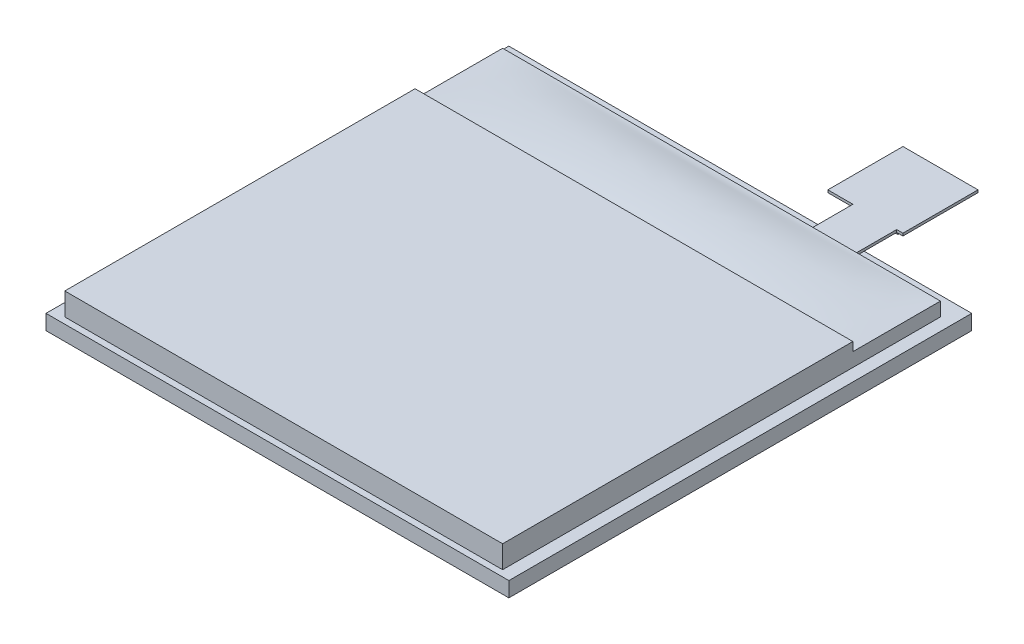
ISO-10303-21;
HEADER;
FILE_DESCRIPTION(('STEP AP214'),'2;1');
FILE_NAME('part.step','',(''),(''),'','','');
FILE_SCHEMA(('AUTOMOTIVE_DESIGN { 1 0 10303 214 1 1 1 1 }'));
ENDSEC;
DATA;
#1=APPLICATION_CONTEXT('core data for automotive mechanical design processes');
#2=APPLICATION_PROTOCOL_DEFINITION('international standard','automotive_design',2000,#1);
#3=PRODUCT_CONTEXT('',#1,'mechanical');
#4=PRODUCT('Part','Part','',(#3));
#5=PRODUCT_RELATED_PRODUCT_CATEGORY('part','',(#4));
#6=PRODUCT_DEFINITION_FORMATION('','',#4);
#7=PRODUCT_DEFINITION_CONTEXT('part definition',#1,'design');
#8=PRODUCT_DEFINITION('design','',#6,#7);
#9=PRODUCT_DEFINITION_SHAPE('','',#8);
#10=(LENGTH_UNIT() NAMED_UNIT(*) SI_UNIT(.MILLI.,.METRE.));
#11=(NAMED_UNIT(*) PLANE_ANGLE_UNIT() SI_UNIT($,.RADIAN.));
#12=(NAMED_UNIT(*) SI_UNIT($,.STERADIAN.) SOLID_ANGLE_UNIT());
#13=UNCERTAINTY_MEASURE_WITH_UNIT(LENGTH_MEASURE(1.E-05),#10,'distance_accuracy_value','');
#14=(GEOMETRIC_REPRESENTATION_CONTEXT(3) GLOBAL_UNCERTAINTY_ASSIGNED_CONTEXT((#13)) GLOBAL_UNIT_ASSIGNED_CONTEXT((#10,
#11,#12)) REPRESENTATION_CONTEXT('',''));
#15=CARTESIAN_POINT('',(0.,0.,0.));
#16=DIRECTION('',(0.,0.,1.));
#17=DIRECTION('',(1.,0.,0.));
#18=AXIS2_PLACEMENT_3D('',#15,#16,#17);
#19=CARTESIAN_POINT('',(0.,1.8,0.));
#20=DIRECTION('',(0.,-1.,0.));
#21=DIRECTION('',(0.,0.,-1.));
#22=AXIS2_PLACEMENT_3D('',#19,#20,#21);
#23=PLANE('',#22);
#24=DIRECTION('',(1.,0.,0.));
#25=VECTOR('',#24,1.);
#26=CARTESIAN_POINT('',(5.00000000000001,1.8,-20.5));
#27=LINE('',#26,#25);
#28=CARTESIAN_POINT('',(5.00000000000001,1.8,-20.5));
#29=VERTEX_POINT('',#28);
#30=CARTESIAN_POINT('',(7.00000000000001,1.8,-20.5));
#31=VERTEX_POINT('',#30);
#32=EDGE_CURVE('E279',#29,#31,#27,.T.);
#33=ORIENTED_EDGE('',*,*,#32,.F.);
#34=DIRECTION('',(0.,0.,1.));
#35=VECTOR('',#34,1.);
#36=CARTESIAN_POINT('',(5.00000000000001,1.8,-26.5));
#37=LINE('',#36,#35);
#38=CARTESIAN_POINT('',(5.00000000000001,1.8,-26.5));
#39=VERTEX_POINT('',#38);
#40=EDGE_CURVE('E300',#39,#29,#37,.T.);
#41=ORIENTED_EDGE('',*,*,#40,.F.);
#42=DIRECTION('',(-1.,0.,0.));
#43=VECTOR('',#42,1.);
#44=CARTESIAN_POINT('',(11.,1.8,-26.5));
#45=LINE('',#44,#43);
#46=CARTESIAN_POINT('',(11.,1.8,-26.5));
#47=VERTEX_POINT('',#46);
#48=EDGE_CURVE('E297',#47,#39,#45,.T.);
#49=ORIENTED_EDGE('',*,*,#48,.F.);
#50=DIRECTION('',(0.,0.,-1.));
#51=VECTOR('',#50,1.);
#52=CARTESIAN_POINT('',(11.,1.8,-20.5));
#53=LINE('',#52,#51);
#54=CARTESIAN_POINT('',(11.,1.8,-20.5));
#55=VERTEX_POINT('',#54);
#56=EDGE_CURVE('E294',#55,#47,#53,.T.);
#57=ORIENTED_EDGE('',*,*,#56,.F.);
#58=DIRECTION('',(1.,0.,0.));
#59=VECTOR('',#58,1.);
#60=CARTESIAN_POINT('',(10.5,1.8,-20.5));
#61=LINE('',#60,#59);
#62=CARTESIAN_POINT('',(10.5,1.8,-20.5));
#63=VERTEX_POINT('',#62);
#64=EDGE_CURVE('E291',#63,#55,#61,.T.);
#65=ORIENTED_EDGE('',*,*,#64,.F.);
#66=DIRECTION('',(0.,0.,-1.));
#67=VECTOR('',#66,1.);
#68=CARTESIAN_POINT('',(10.5,1.8,-17.));
#69=LINE('',#68,#67);
#70=CARTESIAN_POINT('',(10.5,1.8,-17.));
#71=VERTEX_POINT('',#70);
#72=EDGE_CURVE('E288',#71,#63,#69,.T.);
#73=ORIENTED_EDGE('',*,*,#72,.F.);
#74=DIRECTION('',(1.,0.,0.));
#75=VECTOR('',#74,1.);
#76=CARTESIAN_POINT('',(7.00000000000001,1.8,-17.));
#77=LINE('',#76,#75);
#78=CARTESIAN_POINT('',(7.00000000000001,1.8,-17.));
#79=VERTEX_POINT('',#78);
#80=EDGE_CURVE('E286',#79,#71,#77,.T.);
#81=ORIENTED_EDGE('',*,*,#80,.F.);
#82=DIRECTION('',(0.,0.,1.));
#83=VECTOR('',#82,1.);
#84=CARTESIAN_POINT('',(7.00000000000001,1.8,-20.5));
#85=LINE('',#84,#83);
#86=EDGE_CURVE('E282',#31,#79,#85,.T.);
#87=ORIENTED_EDGE('',*,*,#86,.F.);
#88=EDGE_LOOP('',(#33,#41,#49,#57,#65,#73,#81,#87));
#89=FACE_BOUND('',#88,.T.);
#90=DIRECTION('',(-1.,0.,0.));
#91=VECTOR('',#90,1.);
#92=CARTESIAN_POINT('',(6.40000000000001,1.8,-21.5));
#93=LINE('',#92,#91);
#94=CARTESIAN_POINT('',(9.60000000000001,1.8,-21.5));
#95=VERTEX_POINT('',#94);
#96=CARTESIAN_POINT('',(6.40000000000001,1.8,-21.5));
#97=VERTEX_POINT('',#96);
#98=EDGE_CURVE('E265',#95,#97,#93,.T.);
#99=ORIENTED_EDGE('',*,*,#98,.F.);
#100=DIRECTION('',(0.,0.,1.));
#101=VECTOR('',#100,1.);
#102=CARTESIAN_POINT('',(9.60000000000001,1.8,-21.5));
#103=LINE('',#102,#101);
#104=CARTESIAN_POINT('',(9.60000000000001,1.8,-25.5));
#105=VERTEX_POINT('',#104);
#106=EDGE_CURVE('E248',#105,#95,#103,.T.);
#107=ORIENTED_EDGE('',*,*,#106,.F.);
#108=DIRECTION('',(1.,0.,0.));
#109=VECTOR('',#108,1.);
#110=CARTESIAN_POINT('',(6.40000000000001,1.8,-25.5));
#111=LINE('',#110,#109);
#112=CARTESIAN_POINT('',(6.40000000000001,1.8,-25.5));
#113=VERTEX_POINT('',#112);
#114=EDGE_CURVE('E256',#113,#105,#111,.T.);
#115=ORIENTED_EDGE('',*,*,#114,.F.);
#116=DIRECTION('',(0.,0.,-1.));
#117=VECTOR('',#116,1.);
#118=CARTESIAN_POINT('',(6.40000000000001,1.8,-21.5));
#119=LINE('',#118,#117);
#120=EDGE_CURVE('E267',#97,#113,#119,.T.);
#121=ORIENTED_EDGE('',*,*,#120,.F.);
#122=EDGE_LOOP('',(#99,#107,#115,#121));
#123=FACE_BOUND('',#122,.T.);
#124=ADVANCED_FACE('F37',(#89,#123),#23,.T.);
#125=CARTESIAN_POINT('',(-17.5,2.3,-10.));
#126=CARTESIAN_POINT('',(-5.83333333333334,2.3,-10.));
#127=CARTESIAN_POINT('',(5.83333333333333,2.3,-10.));
#128=CARTESIAN_POINT('',(17.5,2.3,-10.));
#129=CARTESIAN_POINT('',(-17.5,2.3,-12.3333333333333));
#130=CARTESIAN_POINT('',(-5.83333333333334,3.18888888888889,-12.3333333333333));
#131=CARTESIAN_POINT('',(5.83333333333333,3.18888888888889,-12.3333333333333));
#132=CARTESIAN_POINT('',(17.5,2.3,-12.3333333333333));
#133=CARTESIAN_POINT('',(-17.5,2.3,-14.6666666666667));
#134=CARTESIAN_POINT('',(-5.83333333333334,3.18888888888889,-14.6666666666667));
#135=CARTESIAN_POINT('',(5.83333333333333,3.18888888888889,-14.6666666666667));
#136=CARTESIAN_POINT('',(17.5,2.3,-14.6666666666667));
#137=CARTESIAN_POINT('',(-17.5,2.3,-17.));
#138=CARTESIAN_POINT('',(-5.83333333333334,2.3,-17.));
#139=CARTESIAN_POINT('',(5.83333333333333,2.3,-17.));
#140=CARTESIAN_POINT('',(17.5,2.3,-17.));
#141=B_SPLINE_SURFACE_WITH_KNOTS('',3,3,((#125,#126,#127,#128),(#129,#130,#131,#132),(#133,#134,
#135,#136),(#137,#138,#139,#140)),.UNSPECIFIED.,.F.,.F.,.F.,(4,4),(4,4),(0.,1.),(0.,1.),.UNSPECIFIED.);
#142=DIRECTION('',(0.,0.,1.));
#143=VECTOR('',#142,1.);
#144=CARTESIAN_POINT('',(-17.5,2.3,-17.));
#145=LINE('',#144,#143);
#146=CARTESIAN_POINT('',(-17.5,2.3,-17.));
#147=VERTEX_POINT('',#146);
#148=CARTESIAN_POINT('',(-17.5,2.3,-10.));
#149=VERTEX_POINT('',#148);
#150=EDGE_CURVE('E362',#147,#149,#145,.T.);
#151=DIRECTION('',(1.,0.,0.));
#152=VECTOR('',#151,1.);
#153=CARTESIAN_POINT('',(0.,2.3,-10.));
#154=LINE('',#153,#152);
#155=CARTESIAN_POINT('',(17.5,2.3,-10.));
#156=VERTEX_POINT('',#155);
#157=EDGE_CURVE('E11',#149,#156,#154,.T.);
#158=DIRECTION('',(0.,0.,-1.));
#159=VECTOR('',#158,1.);
#160=CARTESIAN_POINT('',(17.5,2.3,-17.));
#161=LINE('',#160,#159);
#162=CARTESIAN_POINT('',(17.5,2.3,-17.));
#163=VERTEX_POINT('',#162);
#164=EDGE_CURVE('E357',#156,#163,#161,.T.);
#165=DIRECTION('',(-1.,0.,0.));
#166=VECTOR('',#165,1.);
#167=CARTESIAN_POINT('',(-17.5,2.3,-17.));
#168=LINE('',#167,#166);
#169=EDGE_CURVE('E411',#163,#147,#168,.T.);
#170=ORIENTED_EDGE('',*,*,#150,.T.);
#171=ORIENTED_EDGE('',*,*,#157,.T.);
#172=ORIENTED_EDGE('',*,*,#164,.T.);
#173=ORIENTED_EDGE('',*,*,#169,.T.);
#174=EDGE_LOOP('',(#170,#171,#172,#173));
#175=FACE_BOUND('',#174,.T.);
#176=ADVANCED_FACE('F39',(#175),#141,.F.);
#177=CARTESIAN_POINT('',(0.,1.2,0.));
#178=DIRECTION('',(0.,1.,0.));
#179=DIRECTION('',(0.,0.,1.));
#180=AXIS2_PLACEMENT_3D('',#177,#178,#179);
#181=PLANE('',#180);
#182=DIRECTION('',(0.,0.,-1.));
#183=VECTOR('',#182,1.);
#184=CARTESIAN_POINT('',(18.5,1.2,-18.5));
#185=LINE('',#184,#183);
#186=CARTESIAN_POINT('',(18.5,1.2,18.5));
#187=VERTEX_POINT('',#186);
#188=CARTESIAN_POINT('',(18.5,1.2,-18.5));
#189=VERTEX_POINT('',#188);
#190=EDGE_CURVE('E381',#187,#189,#185,.T.);
#191=ORIENTED_EDGE('',*,*,#190,.T.);
#192=DIRECTION('',(-1.,0.,0.));
#193=VECTOR('',#192,1.);
#194=CARTESIAN_POINT('',(-18.5,1.2,-18.5));
#195=LINE('',#194,#193);
#196=CARTESIAN_POINT('',(-18.5,1.2,-18.5));
#197=VERTEX_POINT('',#196);
#198=EDGE_CURVE('E384',#189,#197,#195,.T.);
#199=ORIENTED_EDGE('',*,*,#198,.T.);
#200=DIRECTION('',(0.,0.,1.));
#201=VECTOR('',#200,1.);
#202=CARTESIAN_POINT('',(-18.5,1.2,-18.5));
#203=LINE('',#202,#201);
#204=CARTESIAN_POINT('',(-18.5,1.2,18.5));
#205=VERTEX_POINT('',#204);
#206=EDGE_CURVE('E387',#197,#205,#203,.T.);
#207=ORIENTED_EDGE('',*,*,#206,.T.);
#208=DIRECTION('',(1.,0.,0.));
#209=VECTOR('',#208,1.);
#210=CARTESIAN_POINT('',(-18.5,1.2,18.5));
#211=LINE('',#210,#209);
#212=EDGE_CURVE('E389',#205,#187,#211,.T.);
#213=ORIENTED_EDGE('',*,*,#212,.T.);
#214=EDGE_LOOP('',(#191,#199,#207,#213));
#215=FACE_BOUND('',#214,.T.);
#216=DIRECTION('',(1.,0.,0.));
#217=VECTOR('',#216,1.);
#218=CARTESIAN_POINT('',(0.,1.2,-17.));
#219=LINE('',#218,#217);
#220=CARTESIAN_POINT('',(-17.5,1.2,-17.));
#221=VERTEX_POINT('',#220);
#222=CARTESIAN_POINT('',(17.5,1.2,-17.));
#223=VERTEX_POINT('',#222);
#224=EDGE_CURVE('E375',#221,#223,#219,.T.);
#225=ORIENTED_EDGE('',*,*,#224,.T.);
#226=DIRECTION('',(0.,0.,1.));
#227=VECTOR('',#226,1.);
#228=CARTESIAN_POINT('',(17.5,1.2,0.));
#229=LINE('',#228,#227);
#230=CARTESIAN_POINT('',(17.5,1.2,18.));
#231=VERTEX_POINT('',#230);
#232=EDGE_CURVE('E378',#223,#231,#229,.T.);
#233=ORIENTED_EDGE('',*,*,#232,.T.);
#234=DIRECTION('',(-1.,0.,0.));
#235=VECTOR('',#234,1.);
#236=CARTESIAN_POINT('',(0.,1.2,18.));
#237=LINE('',#236,#235);
#238=CARTESIAN_POINT('',(-17.5,1.2,18.));
#239=VERTEX_POINT('',#238);
#240=EDGE_CURVE('E370',#231,#239,#237,.T.);
#241=ORIENTED_EDGE('',*,*,#240,.T.);
#242=DIRECTION('',(0.,0.,-1.));
#243=VECTOR('',#242,1.);
#244=CARTESIAN_POINT('',(-17.5,1.2,0.));
#245=LINE('',#244,#243);
#246=EDGE_CURVE('E373',#239,#221,#245,.T.);
#247=ORIENTED_EDGE('',*,*,#246,.T.);
#248=EDGE_LOOP('',(#225,#233,#241,#247));
#249=FACE_BOUND('',#248,.T.);
#250=ADVANCED_FACE('F427',(#215,#249),#181,.T.);
#251=CARTESIAN_POINT('',(18.5,1.2,-18.5));
#252=DIRECTION('',(-1.,0.,0.));
#253=DIRECTION('',(0.,0.,1.));
#254=AXIS2_PLACEMENT_3D('',#251,#252,#253);
#255=PLANE('',#254);
#256=DIRECTION('',(0.,0.,-1.));
#257=VECTOR('',#256,1.);
#258=CARTESIAN_POINT('',(18.5,0.,-18.5));
#259=LINE('',#258,#257);
#260=CARTESIAN_POINT('',(18.5,0.,18.5));
#261=VERTEX_POINT('',#260);
#262=CARTESIAN_POINT('',(18.5,0.,-18.5));
#263=VERTEX_POINT('',#262);
#264=EDGE_CURVE('E380',#261,#263,#259,.T.);
#265=ORIENTED_EDGE('',*,*,#264,.T.);
#266=DIRECTION('',(0.,-1.,0.));
#267=VECTOR('',#266,1.);
#268=CARTESIAN_POINT('',(18.5,1.2,-18.5));
#269=LINE('',#268,#267);
#270=EDGE_CURVE('E47',#189,#263,#269,.T.);
#271=ORIENTED_EDGE('',*,*,#270,.F.);
#272=ORIENTED_EDGE('',*,*,#190,.F.);
#273=DIRECTION('',(0.,-1.,0.));
#274=VECTOR('',#273,1.);
#275=CARTESIAN_POINT('',(18.5,1.2,18.5));
#276=LINE('',#275,#274);
#277=EDGE_CURVE('E391',#187,#261,#276,.T.);
#278=ORIENTED_EDGE('',*,*,#277,.T.);
#279=EDGE_LOOP('',(#265,#271,#272,#278));
#280=FACE_BOUND('',#279,.T.);
#281=ADVANCED_FACE('F521',(#280),#255,.F.);
#282=CARTESIAN_POINT('',(-18.5,1.2,-18.5));
#283=DIRECTION('',(0.,0.,1.));
#284=DIRECTION('',(1.,0.,0.));
#285=AXIS2_PLACEMENT_3D('',#282,#283,#284);
#286=PLANE('',#285);
#287=DIRECTION('',(-1.,0.,0.));
#288=VECTOR('',#287,1.);
#289=CARTESIAN_POINT('',(-18.5,0.,-18.5));
#290=LINE('',#289,#288);
#291=CARTESIAN_POINT('',(-18.5,0.,-18.5));
#292=VERTEX_POINT('',#291);
#293=EDGE_CURVE('E394',#263,#292,#290,.T.);
#294=ORIENTED_EDGE('',*,*,#293,.T.);
#295=DIRECTION('',(0.,-1.,0.));
#296=VECTOR('',#295,1.);
#297=CARTESIAN_POINT('',(-18.5,1.2,-18.5));
#298=LINE('',#297,#296);
#299=EDGE_CURVE('E404',#197,#292,#298,.T.);
#300=ORIENTED_EDGE('',*,*,#299,.F.);
#301=ORIENTED_EDGE('',*,*,#198,.F.);
#302=ORIENTED_EDGE('',*,*,#270,.T.);
#303=EDGE_LOOP('',(#294,#300,#301,#302));
#304=FACE_BOUND('',#303,.T.);
#305=ADVANCED_FACE('F533',(#304),#286,.F.);
#306=CARTESIAN_POINT('',(-18.5,1.2,-18.5));
#307=DIRECTION('',(1.,0.,0.));
#308=DIRECTION('',(0.,0.,-1.));
#309=AXIS2_PLACEMENT_3D('',#306,#307,#308);
#310=PLANE('',#309);
#311=DIRECTION('',(0.,0.,1.));
#312=VECTOR('',#311,1.);
#313=CARTESIAN_POINT('',(-18.5,0.,-18.5));
#314=LINE('',#313,#312);
#315=CARTESIAN_POINT('',(-18.5,0.,18.5));
#316=VERTEX_POINT('',#315);
#317=EDGE_CURVE('E396',#292,#316,#314,.T.);
#318=ORIENTED_EDGE('',*,*,#317,.T.);
#319=DIRECTION('',(0.,-1.,0.));
#320=VECTOR('',#319,1.);
#321=CARTESIAN_POINT('',(-18.5,1.2,18.5));
#322=LINE('',#321,#320);
#323=EDGE_CURVE('E401',#205,#316,#322,.T.);
#324=ORIENTED_EDGE('',*,*,#323,.F.);
#325=ORIENTED_EDGE('',*,*,#206,.F.);
#326=ORIENTED_EDGE('',*,*,#299,.T.);
#327=EDGE_LOOP('',(#318,#324,#325,#326));
#328=FACE_BOUND('',#327,.T.);
#329=ADVANCED_FACE('F529',(#328),#310,.F.);
#330=CARTESIAN_POINT('',(-18.5,1.2,18.5));
#331=DIRECTION('',(0.,0.,-1.));
#332=DIRECTION('',(-1.,0.,0.));
#333=AXIS2_PLACEMENT_3D('',#330,#331,#332);
#334=PLANE('',#333);
#335=DIRECTION('',(1.,0.,0.));
#336=VECTOR('',#335,1.);
#337=CARTESIAN_POINT('',(-18.5,0.,18.5));
#338=LINE('',#337,#336);
#339=EDGE_CURVE('E385',#316,#261,#338,.T.);
#340=ORIENTED_EDGE('',*,*,#339,.T.);
#341=ORIENTED_EDGE('',*,*,#277,.F.);
#342=ORIENTED_EDGE('',*,*,#212,.F.);
#343=ORIENTED_EDGE('',*,*,#323,.T.);
#344=EDGE_LOOP('',(#340,#341,#342,#343));
#345=FACE_BOUND('',#344,.T.);
#346=ADVANCED_FACE('F525',(#345),#334,.F.);
#347=CARTESIAN_POINT('',(0.,0.,0.));
#348=DIRECTION('',(0.,1.,0.));
#349=DIRECTION('',(0.,0.,1.));
#350=AXIS2_PLACEMENT_3D('',#347,#348,#349);
#351=PLANE('',#350);
#352=ORIENTED_EDGE('',*,*,#264,.F.);
#353=ORIENTED_EDGE('',*,*,#339,.F.);
#354=ORIENTED_EDGE('',*,*,#317,.F.);
#355=ORIENTED_EDGE('',*,*,#293,.F.);
#356=EDGE_LOOP('',(#352,#353,#354,#355));
#357=FACE_BOUND('',#356,.T.);
#358=ADVANCED_FACE('F515',(#357),#351,.F.);
#359=CARTESIAN_POINT('',(17.5,2.3,-17.));
#360=DIRECTION('',(-1.,0.,0.));
#361=DIRECTION('',(0.,0.,1.));
#362=AXIS2_PLACEMENT_3D('',#359,#360,#361);
#363=PLANE('',#362);
#364=DIRECTION('',(0.,-1.,0.));
#365=VECTOR('',#364,1.);
#366=CARTESIAN_POINT('',(17.5,2.3,18.));
#367=LINE('',#366,#365);
#368=CARTESIAN_POINT('',(17.5,3.,18.));
#369=VERTEX_POINT('',#368);
#370=EDGE_CURVE('E358',#369,#231,#367,.T.);
#371=ORIENTED_EDGE('',*,*,#370,.T.);
#372=ORIENTED_EDGE('',*,*,#232,.F.);
#373=DIRECTION('',(0.,-1.,0.));
#374=VECTOR('',#373,1.);
#375=CARTESIAN_POINT('',(17.5,2.3,-17.));
#376=LINE('',#375,#374);
#377=EDGE_CURVE('E367',#163,#223,#376,.T.);
#378=ORIENTED_EDGE('',*,*,#377,.F.);
#379=ORIENTED_EDGE('',*,*,#164,.F.);
#380=DIRECTION('',(0.,-1.,0.));
#381=VECTOR('',#380,1.);
#382=CARTESIAN_POINT('',(17.5,3.,-10.));
#383=LINE('',#382,#381);
#384=CARTESIAN_POINT('',(17.5,3.,-10.));
#385=VERTEX_POINT('',#384);
#386=EDGE_CURVE('E355',#385,#156,#383,.T.);
#387=ORIENTED_EDGE('',*,*,#386,.F.);
#388=DIRECTION('',(0.,0.,-1.));
#389=VECTOR('',#388,1.);
#390=CARTESIAN_POINT('',(17.5,3.,18.));
#391=LINE('',#390,#389);
#392=EDGE_CURVE('E348',#369,#385,#391,.T.);
#393=ORIENTED_EDGE('',*,*,#392,.F.);
#394=EDGE_LOOP('',(#371,#372,#378,#379,#387,#393));
#395=FACE_BOUND('',#394,.T.);
#396=ADVANCED_FACE('F423',(#395),#363,.F.);
#397=CARTESIAN_POINT('',(-17.5,2.3,-17.));
#398=DIRECTION('',(0.,0.,1.));
#399=DIRECTION('',(1.,0.,0.));
#400=AXIS2_PLACEMENT_3D('',#397,#398,#399);
#401=PLANE('',#400);
#402=DIRECTION('',(0.,1.,0.));
#403=VECTOR('',#402,1.);
#404=CARTESIAN_POINT('',(7.00000000000001,1.8,-17.));
#405=LINE('',#404,#403);
#406=CARTESIAN_POINT('',(7.00000000000001,2.,-17.));
#407=VERTEX_POINT('',#406);
#408=EDGE_CURVE('E339',#79,#407,#405,.T.);
#409=ORIENTED_EDGE('',*,*,#408,.F.);
#410=ORIENTED_EDGE('',*,*,#80,.T.);
#411=DIRECTION('',(0.,1.,0.));
#412=VECTOR('',#411,1.);
#413=CARTESIAN_POINT('',(10.5,1.8,-17.));
#414=LINE('',#413,#412);
#415=CARTESIAN_POINT('',(10.5,2.,-17.));
#416=VERTEX_POINT('',#415);
#417=EDGE_CURVE('E337',#71,#416,#414,.T.);
#418=ORIENTED_EDGE('',*,*,#417,.T.);
#419=DIRECTION('',(1.,0.,0.));
#420=VECTOR('',#419,1.);
#421=CARTESIAN_POINT('',(7.00000000000001,2.,-17.));
#422=LINE('',#421,#420);
#423=EDGE_CURVE('E309',#407,#416,#422,.T.);
#424=ORIENTED_EDGE('',*,*,#423,.F.);
#425=EDGE_LOOP('',(#409,#410,#418,#424));
#426=FACE_BOUND('',#425,.T.);
#427=ORIENTED_EDGE('',*,*,#224,.F.);
#428=DIRECTION('',(0.,-1.,0.));
#429=VECTOR('',#428,1.);
#430=CARTESIAN_POINT('',(-17.5,2.3,-17.));
#431=LINE('',#430,#429);
#432=EDGE_CURVE('E364',#147,#221,#431,.T.);
#433=ORIENTED_EDGE('',*,*,#432,.F.);
#434=ORIENTED_EDGE('',*,*,#169,.F.);
#435=ORIENTED_EDGE('',*,*,#377,.T.);
#436=EDGE_LOOP('',(#427,#433,#434,#435));
#437=FACE_BOUND('',#436,.T.);
#438=ADVANCED_FACE('F421',(#426,#437),#401,.F.);
#439=CARTESIAN_POINT('',(-17.5,2.3,-17.));
#440=DIRECTION('',(1.,0.,0.));
#441=DIRECTION('',(0.,0.,-1.));
#442=AXIS2_PLACEMENT_3D('',#439,#440,#441);
#443=PLANE('',#442);
#444=DIRECTION('',(0.,-1.,0.));
#445=VECTOR('',#444,1.);
#446=CARTESIAN_POINT('',(-17.5,2.3,18.));
#447=LINE('',#446,#445);
#448=CARTESIAN_POINT('',(-17.5,3.,18.));
#449=VERTEX_POINT('',#448);
#450=EDGE_CURVE('E361',#449,#239,#447,.T.);
#451=ORIENTED_EDGE('',*,*,#450,.F.);
#452=DIRECTION('',(0.,0.,1.));
#453=VECTOR('',#452,1.);
#454=CARTESIAN_POINT('',(-17.5,3.,18.));
#455=LINE('',#454,#453);
#456=CARTESIAN_POINT('',(-17.5,3.,-10.));
#457=VERTEX_POINT('',#456);
#458=EDGE_CURVE('E328',#457,#449,#455,.T.);
#459=ORIENTED_EDGE('',*,*,#458,.F.);
#460=DIRECTION('',(0.,-1.,0.));
#461=VECTOR('',#460,1.);
#462=CARTESIAN_POINT('',(-17.5,3.,-10.));
#463=LINE('',#462,#461);
#464=EDGE_CURVE('E352',#457,#149,#463,.T.);
#465=ORIENTED_EDGE('',*,*,#464,.T.);
#466=ORIENTED_EDGE('',*,*,#150,.F.);
#467=ORIENTED_EDGE('',*,*,#432,.T.);
#468=ORIENTED_EDGE('',*,*,#246,.F.);
#469=EDGE_LOOP('',(#451,#459,#465,#466,#467,#468));
#470=FACE_BOUND('',#469,.T.);
#471=ADVANCED_FACE('F434',(#470),#443,.F.);
#472=CARTESIAN_POINT('',(-17.5,2.3,18.));
#473=DIRECTION('',(0.,0.,-1.));
#474=DIRECTION('',(-1.,0.,0.));
#475=AXIS2_PLACEMENT_3D('',#472,#473,#474);
#476=PLANE('',#475);
#477=ORIENTED_EDGE('',*,*,#240,.F.);
#478=ORIENTED_EDGE('',*,*,#370,.F.);
#479=DIRECTION('',(1.,0.,0.));
#480=VECTOR('',#479,1.);
#481=CARTESIAN_POINT('',(-17.5,3.,18.));
#482=LINE('',#481,#480);
#483=EDGE_CURVE('E345',#449,#369,#482,.T.);
#484=ORIENTED_EDGE('',*,*,#483,.F.);
#485=ORIENTED_EDGE('',*,*,#450,.T.);
#486=EDGE_LOOP('',(#477,#478,#484,#485));
#487=FACE_BOUND('',#486,.T.);
#488=ADVANCED_FACE('F429',(#487),#476,.F.);
#489=CARTESIAN_POINT('',(-17.5,3.,-10.));
#490=DIRECTION('',(0.,0.,1.));
#491=DIRECTION('',(1.,0.,0.));
#492=AXIS2_PLACEMENT_3D('',#489,#490,#491);
#493=PLANE('',#492);
#494=ORIENTED_EDGE('',*,*,#157,.F.);
#495=ORIENTED_EDGE('',*,*,#464,.F.);
#496=DIRECTION('',(-1.,0.,0.));
#497=VECTOR('',#496,1.);
#498=CARTESIAN_POINT('',(-17.5,3.,-10.));
#499=LINE('',#498,#497);
#500=EDGE_CURVE('E350',#385,#457,#499,.T.);
#501=ORIENTED_EDGE('',*,*,#500,.F.);
#502=ORIENTED_EDGE('',*,*,#386,.T.);
#503=EDGE_LOOP('',(#494,#495,#501,#502));
#504=FACE_BOUND('',#503,.T.);
#505=ADVANCED_FACE('F438',(#504),#493,.F.);
#506=CARTESIAN_POINT('',(0.,3.,0.));
#507=DIRECTION('',(0.,-1.,0.));
#508=DIRECTION('',(0.,0.,-1.));
#509=AXIS2_PLACEMENT_3D('',#506,#507,#508);
#510=PLANE('',#509);
#511=ORIENTED_EDGE('',*,*,#458,.T.);
#512=ORIENTED_EDGE('',*,*,#483,.T.);
#513=ORIENTED_EDGE('',*,*,#392,.T.);
#514=ORIENTED_EDGE('',*,*,#500,.T.);
#515=EDGE_LOOP('',(#511,#512,#513,#514));
#516=FACE_BOUND('',#515,.T.);
#517=ADVANCED_FACE('F440',(#516),#510,.F.);
#518=CARTESIAN_POINT('',(5.00000000000001,1.8,-20.5));
#519=DIRECTION('',(0.,0.,1.));
#520=DIRECTION('',(1.,0.,0.));
#521=AXIS2_PLACEMENT_3D('',#518,#519,#520);
#522=PLANE('',#521);
#523=DIRECTION('',(1.,0.,0.));
#524=VECTOR('',#523,1.);
#525=CARTESIAN_POINT('',(5.00000000000001,2.,-20.5));
#526=LINE('',#525,#524);
#527=CARTESIAN_POINT('',(5.00000000000001,2.,-20.5));
#528=VERTEX_POINT('',#527);
#529=CARTESIAN_POINT('',(7.00000000000001,2.,-20.5));
#530=VERTEX_POINT('',#529);
#531=EDGE_CURVE('E278',#528,#530,#526,.T.);
#532=ORIENTED_EDGE('',*,*,#531,.F.);
#533=DIRECTION('',(0.,1.,0.));
#534=VECTOR('',#533,1.);
#535=CARTESIAN_POINT('',(5.00000000000001,1.8,-20.5));
#536=LINE('',#535,#534);
#537=EDGE_CURVE('E326',#29,#528,#536,.T.);
#538=ORIENTED_EDGE('',*,*,#537,.F.);
#539=ORIENTED_EDGE('',*,*,#32,.T.);
#540=DIRECTION('',(0.,1.,0.));
#541=VECTOR('',#540,1.);
#542=CARTESIAN_POINT('',(7.00000000000001,1.8,-20.5));
#543=LINE('',#542,#541);
#544=EDGE_CURVE('E303',#31,#530,#543,.T.);
#545=ORIENTED_EDGE('',*,*,#544,.T.);
#546=EDGE_LOOP('',(#532,#538,#539,#545));
#547=FACE_BOUND('',#546,.T.);
#548=ADVANCED_FACE('F442',(#547),#522,.T.);
#549=CARTESIAN_POINT('',(5.00000000000001,1.8,-26.5));
#550=DIRECTION('',(-1.,0.,0.));
#551=DIRECTION('',(0.,0.,1.));
#552=AXIS2_PLACEMENT_3D('',#549,#550,#551);
#553=PLANE('',#552);
#554=DIRECTION('',(0.,0.,1.));
#555=VECTOR('',#554,1.);
#556=CARTESIAN_POINT('',(5.00000000000001,2.,-26.5));
#557=LINE('',#556,#555);
#558=CARTESIAN_POINT('',(5.00000000000001,2.,-26.5));
#559=VERTEX_POINT('',#558);
#560=EDGE_CURVE('E283',#559,#528,#557,.T.);
#561=ORIENTED_EDGE('',*,*,#560,.F.);
#562=DIRECTION('',(0.,1.,0.));
#563=VECTOR('',#562,1.);
#564=CARTESIAN_POINT('',(5.00000000000001,1.8,-26.5));
#565=LINE('',#564,#563);
#566=EDGE_CURVE('E329',#39,#559,#565,.T.);
#567=ORIENTED_EDGE('',*,*,#566,.F.);
#568=ORIENTED_EDGE('',*,*,#40,.T.);
#569=ORIENTED_EDGE('',*,*,#537,.T.);
#570=EDGE_LOOP('',(#561,#567,#568,#569));
#571=FACE_BOUND('',#570,.T.);
#572=ADVANCED_FACE('F448',(#571),#553,.T.);
#573=CARTESIAN_POINT('',(11.,1.8,-26.5));
#574=DIRECTION('',(0.,0.,-1.));
#575=DIRECTION('',(-1.,0.,0.));
#576=AXIS2_PLACEMENT_3D('',#573,#574,#575);
#577=PLANE('',#576);
#578=DIRECTION('',(-1.,0.,0.));
#579=VECTOR('',#578,1.);
#580=CARTESIAN_POINT('',(11.,2.,-26.5));
#581=LINE('',#580,#579);
#582=CARTESIAN_POINT('',(11.,2.,-26.5));
#583=VERTEX_POINT('',#582);
#584=EDGE_CURVE('E321',#583,#559,#581,.T.);
#585=ORIENTED_EDGE('',*,*,#584,.F.);
#586=DIRECTION('',(0.,1.,0.));
#587=VECTOR('',#586,1.);
#588=CARTESIAN_POINT('',(11.,1.8,-26.5));
#589=LINE('',#588,#587);
#590=EDGE_CURVE('E331',#47,#583,#589,.T.);
#591=ORIENTED_EDGE('',*,*,#590,.F.);
#592=ORIENTED_EDGE('',*,*,#48,.T.);
#593=ORIENTED_EDGE('',*,*,#566,.T.);
#594=EDGE_LOOP('',(#585,#591,#592,#593));
#595=FACE_BOUND('',#594,.T.);
#596=ADVANCED_FACE('F471',(#595),#577,.T.);
#597=CARTESIAN_POINT('',(11.,1.8,-20.5));
#598=DIRECTION('',(1.,0.,0.));
#599=DIRECTION('',(0.,0.,-1.));
#600=AXIS2_PLACEMENT_3D('',#597,#598,#599);
#601=PLANE('',#600);
#602=DIRECTION('',(0.,0.,-1.));
#603=VECTOR('',#602,1.);
#604=CARTESIAN_POINT('',(11.,2.,-20.5));
#605=LINE('',#604,#603);
#606=CARTESIAN_POINT('',(11.,2.,-20.5));
#607=VERTEX_POINT('',#606);
#608=EDGE_CURVE('E318',#607,#583,#605,.T.);
#609=ORIENTED_EDGE('',*,*,#608,.F.);
#610=DIRECTION('',(0.,1.,0.));
#611=VECTOR('',#610,1.);
#612=CARTESIAN_POINT('',(11.,1.8,-20.5));
#613=LINE('',#612,#611);
#614=EDGE_CURVE('E333',#55,#607,#613,.T.);
#615=ORIENTED_EDGE('',*,*,#614,.F.);
#616=ORIENTED_EDGE('',*,*,#56,.T.);
#617=ORIENTED_EDGE('',*,*,#590,.T.);
#618=EDGE_LOOP('',(#609,#615,#616,#617));
#619=FACE_BOUND('',#618,.T.);
#620=ADVANCED_FACE('F475',(#619),#601,.T.);
#621=CARTESIAN_POINT('',(10.5,1.8,-20.5));
#622=DIRECTION('',(0.,0.,1.));
#623=DIRECTION('',(1.,0.,0.));
#624=AXIS2_PLACEMENT_3D('',#621,#622,#623);
#625=PLANE('',#624);
#626=DIRECTION('',(1.,0.,0.));
#627=VECTOR('',#626,1.);
#628=CARTESIAN_POINT('',(10.5,2.,-20.5));
#629=LINE('',#628,#627);
#630=CARTESIAN_POINT('',(10.5,2.,-20.5));
#631=VERTEX_POINT('',#630);
#632=EDGE_CURVE('E315',#631,#607,#629,.T.);
#633=ORIENTED_EDGE('',*,*,#632,.F.);
#634=DIRECTION('',(0.,1.,0.));
#635=VECTOR('',#634,1.);
#636=CARTESIAN_POINT('',(10.5,1.8,-20.5));
#637=LINE('',#636,#635);
#638=EDGE_CURVE('E335',#63,#631,#637,.T.);
#639=ORIENTED_EDGE('',*,*,#638,.F.);
#640=ORIENTED_EDGE('',*,*,#64,.T.);
#641=ORIENTED_EDGE('',*,*,#614,.T.);
#642=EDGE_LOOP('',(#633,#639,#640,#641));
#643=FACE_BOUND('',#642,.T.);
#644=ADVANCED_FACE('F479',(#643),#625,.T.);
#645=CARTESIAN_POINT('',(10.5,1.8,-17.));
#646=DIRECTION('',(1.,0.,0.));
#647=DIRECTION('',(0.,0.,-1.));
#648=AXIS2_PLACEMENT_3D('',#645,#646,#647);
#649=PLANE('',#648);
#650=DIRECTION('',(0.,0.,-1.));
#651=VECTOR('',#650,1.);
#652=CARTESIAN_POINT('',(10.5,2.,-17.));
#653=LINE('',#652,#651);
#654=EDGE_CURVE('E312',#416,#631,#653,.T.);
#655=ORIENTED_EDGE('',*,*,#654,.F.);
#656=ORIENTED_EDGE('',*,*,#417,.F.);
#657=ORIENTED_EDGE('',*,*,#72,.T.);
#658=ORIENTED_EDGE('',*,*,#638,.T.);
#659=EDGE_LOOP('',(#655,#656,#657,#658));
#660=FACE_BOUND('',#659,.T.);
#661=ADVANCED_FACE('F483',(#660),#649,.T.);
#662=CARTESIAN_POINT('',(7.00000000000001,1.8,-20.5));
#663=DIRECTION('',(-1.,0.,0.));
#664=DIRECTION('',(0.,0.,1.));
#665=AXIS2_PLACEMENT_3D('',#662,#663,#664);
#666=PLANE('',#665);
#667=DIRECTION('',(0.,0.,1.));
#668=VECTOR('',#667,1.);
#669=CARTESIAN_POINT('',(7.00000000000001,2.,-20.5));
#670=LINE('',#669,#668);
#671=EDGE_CURVE('E306',#530,#407,#670,.T.);
#672=ORIENTED_EDGE('',*,*,#671,.F.);
#673=ORIENTED_EDGE('',*,*,#544,.F.);
#674=ORIENTED_EDGE('',*,*,#86,.T.);
#675=ORIENTED_EDGE('',*,*,#408,.T.);
#676=EDGE_LOOP('',(#672,#673,#674,#675));
#677=FACE_BOUND('',#676,.T.);
#678=ADVANCED_FACE('F467',(#677),#666,.T.);
#679=CARTESIAN_POINT('',(0.,2.,0.));
#680=DIRECTION('',(0.,-1.,0.));
#681=DIRECTION('',(0.,0.,-1.));
#682=AXIS2_PLACEMENT_3D('',#679,#680,#681);
#683=PLANE('',#682);
#684=ORIENTED_EDGE('',*,*,#531,.T.);
#685=ORIENTED_EDGE('',*,*,#671,.T.);
#686=ORIENTED_EDGE('',*,*,#423,.T.);
#687=ORIENTED_EDGE('',*,*,#654,.T.);
#688=ORIENTED_EDGE('',*,*,#632,.T.);
#689=ORIENTED_EDGE('',*,*,#608,.T.);
#690=ORIENTED_EDGE('',*,*,#584,.T.);
#691=ORIENTED_EDGE('',*,*,#560,.T.);
#692=EDGE_LOOP('',(#684,#685,#686,#687,#688,#689,#690,#691));
#693=FACE_BOUND('',#692,.T.);
#694=ADVANCED_FACE('F464',(#693),#683,.F.);
#695=CARTESIAN_POINT('',(9.60000000000001,0.7,-21.5));
#696=DIRECTION('',(-1.,0.,0.));
#697=DIRECTION('',(0.,0.,1.));
#698=AXIS2_PLACEMENT_3D('',#695,#696,#697);
#699=PLANE('',#698);
#700=ORIENTED_EDGE('',*,*,#106,.T.);
#701=DIRECTION('',(0.,1.,0.));
#702=VECTOR('',#701,1.);
#703=CARTESIAN_POINT('',(9.60000000000001,0.7,-21.5));
#704=LINE('',#703,#702);
#705=CARTESIAN_POINT('',(9.60000000000001,0.7,-21.5));
#706=VERTEX_POINT('',#705);
#707=EDGE_CURVE('E276',#706,#95,#704,.T.);
#708=ORIENTED_EDGE('',*,*,#707,.F.);
#709=DIRECTION('',(0.,0.,1.));
#710=VECTOR('',#709,1.);
#711=CARTESIAN_POINT('',(9.60000000000001,0.7,-21.5));
#712=LINE('',#711,#710);
#713=CARTESIAN_POINT('',(9.60000000000001,0.7,-25.5));
#714=VERTEX_POINT('',#713);
#715=EDGE_CURVE('E252',#714,#706,#712,.T.);
#716=ORIENTED_EDGE('',*,*,#715,.F.);
#717=DIRECTION('',(0.,1.,0.));
#718=VECTOR('',#717,1.);
#719=CARTESIAN_POINT('',(9.60000000000001,0.7,-25.5));
#720=LINE('',#719,#718);
#721=EDGE_CURVE('E262',#714,#105,#720,.T.);
#722=ORIENTED_EDGE('',*,*,#721,.T.);
#723=EDGE_LOOP('',(#700,#708,#716,#722));
#724=FACE_BOUND('',#723,.T.);
#725=ADVANCED_FACE('F462',(#724),#699,.F.);
#726=CARTESIAN_POINT('',(6.40000000000001,0.7,-21.5));
#727=DIRECTION('',(0.,0.,-1.));
#728=DIRECTION('',(-1.,0.,0.));
#729=AXIS2_PLACEMENT_3D('',#726,#727,#728);
#730=PLANE('',#729);
#731=ORIENTED_EDGE('',*,*,#98,.T.);
#732=DIRECTION('',(0.,1.,0.));
#733=VECTOR('',#732,1.);
#734=CARTESIAN_POINT('',(6.40000000000001,0.7,-21.5));
#735=LINE('',#734,#733);
#736=CARTESIAN_POINT('',(6.40000000000001,0.7,-21.5));
#737=VERTEX_POINT('',#736);
#738=EDGE_CURVE('E273',#737,#97,#735,.T.);
#739=ORIENTED_EDGE('',*,*,#738,.F.);
#740=DIRECTION('',(-1.,0.,0.));
#741=VECTOR('',#740,1.);
#742=CARTESIAN_POINT('',(6.40000000000001,0.7,-21.5));
#743=LINE('',#742,#741);
#744=EDGE_CURVE('E255',#706,#737,#743,.T.);
#745=ORIENTED_EDGE('',*,*,#744,.F.);
#746=ORIENTED_EDGE('',*,*,#707,.T.);
#747=EDGE_LOOP('',(#731,#739,#745,#746));
#748=FACE_BOUND('',#747,.T.);
#749=ADVANCED_FACE('F659',(#748),#730,.F.);
#750=CARTESIAN_POINT('',(6.40000000000001,0.7,-21.5));
#751=DIRECTION('',(1.,0.,0.));
#752=DIRECTION('',(0.,0.,-1.));
#753=AXIS2_PLACEMENT_3D('',#750,#751,#752);
#754=PLANE('',#753);
#755=ORIENTED_EDGE('',*,*,#120,.T.);
#756=DIRECTION('',(0.,1.,0.));
#757=VECTOR('',#756,1.);
#758=CARTESIAN_POINT('',(6.40000000000001,0.7,-25.5));
#759=LINE('',#758,#757);
#760=CARTESIAN_POINT('',(6.40000000000001,0.7,-25.5));
#761=VERTEX_POINT('',#760);
#762=EDGE_CURVE('E62',#761,#113,#759,.T.);
#763=ORIENTED_EDGE('',*,*,#762,.F.);
#764=DIRECTION('',(0.,0.,-1.));
#765=VECTOR('',#764,1.);
#766=CARTESIAN_POINT('',(6.40000000000001,0.7,-21.5));
#767=LINE('',#766,#765);
#768=EDGE_CURVE('E258',#737,#761,#767,.T.);
#769=ORIENTED_EDGE('',*,*,#768,.F.);
#770=ORIENTED_EDGE('',*,*,#738,.T.);
#771=EDGE_LOOP('',(#755,#763,#769,#770));
#772=FACE_BOUND('',#771,.T.);
#773=ADVANCED_FACE('F668',(#772),#754,.F.);
#774=CARTESIAN_POINT('',(6.40000000000001,0.7,-25.5));
#775=DIRECTION('',(0.,0.,1.));
#776=DIRECTION('',(1.,0.,0.));
#777=AXIS2_PLACEMENT_3D('',#774,#775,#776);
#778=PLANE('',#777);
#779=ORIENTED_EDGE('',*,*,#114,.T.);
#780=ORIENTED_EDGE('',*,*,#721,.F.);
#781=DIRECTION('',(1.,0.,0.));
#782=VECTOR('',#781,1.);
#783=CARTESIAN_POINT('',(6.40000000000001,0.7,-25.5));
#784=LINE('',#783,#782);
#785=EDGE_CURVE('E260',#761,#714,#784,.T.);
#786=ORIENTED_EDGE('',*,*,#785,.F.);
#787=ORIENTED_EDGE('',*,*,#762,.T.);
#788=EDGE_LOOP('',(#779,#780,#786,#787));
#789=FACE_BOUND('',#788,.T.);
#790=ADVANCED_FACE('F677',(#789),#778,.F.);
#791=CARTESIAN_POINT('',(0.,0.7,0.));
#792=DIRECTION('',(0.,-1.,0.));
#793=DIRECTION('',(0.,0.,-1.));
#794=AXIS2_PLACEMENT_3D('',#791,#792,#793);
#795=PLANE('',#794);
#796=DIRECTION('',(0.,0.,1.));
#797=VECTOR('',#796,1.);
#798=CARTESIAN_POINT('',(9.00000000000001,0.7,-24.9));
#799=LINE('',#798,#797);
#800=CARTESIAN_POINT('',(9.00000000000001,0.7,-24.9));
#801=VERTEX_POINT('',#800);
#802=CARTESIAN_POINT('',(9.00000000000001,0.7,-22.1));
#803=VERTEX_POINT('',#802);
#804=EDGE_CURVE('E54',#801,#803,#799,.T.);
#805=ORIENTED_EDGE('',*,*,#804,.F.);
#806=DIRECTION('',(1.,0.,0.));
#807=VECTOR('',#806,1.);
#808=CARTESIAN_POINT('',(7.00000000000001,0.7,-24.9));
#809=LINE('',#808,#807);
#810=CARTESIAN_POINT('',(7.00000000000001,0.7,-24.9));
#811=VERTEX_POINT('',#810);
#812=EDGE_CURVE('E233',#811,#801,#809,.T.);
#813=ORIENTED_EDGE('',*,*,#812,.F.);
#814=DIRECTION('',(0.,0.,-1.));
#815=VECTOR('',#814,1.);
#816=CARTESIAN_POINT('',(7.00000000000001,0.7,-24.9));
#817=LINE('',#816,#815);
#818=CARTESIAN_POINT('',(7.00000000000001,0.7,-22.1));
#819=VERTEX_POINT('',#818);
#820=EDGE_CURVE('E236',#819,#811,#817,.T.);
#821=ORIENTED_EDGE('',*,*,#820,.F.);
#822=DIRECTION('',(-1.,0.,0.));
#823=VECTOR('',#822,1.);
#824=CARTESIAN_POINT('',(7.00000000000001,0.7,-22.1));
#825=LINE('',#824,#823);
#826=EDGE_CURVE('E242',#803,#819,#825,.T.);
#827=ORIENTED_EDGE('',*,*,#826,.F.);
#828=EDGE_LOOP('',(#805,#813,#821,#827));
#829=FACE_BOUND('',#828,.T.);
#830=ORIENTED_EDGE('',*,*,#715,.T.);
#831=ORIENTED_EDGE('',*,*,#744,.T.);
#832=ORIENTED_EDGE('',*,*,#768,.T.);
#833=ORIENTED_EDGE('',*,*,#785,.T.);
#834=EDGE_LOOP('',(#830,#831,#832,#833));
#835=FACE_BOUND('',#834,.T.);
#836=ADVANCED_FACE('F687',(#829,#835),#795,.T.);
#837=CARTESIAN_POINT('',(9.00000000000001,1.5,-24.9));
#838=DIRECTION('',(1.,0.,0.));
#839=DIRECTION('',(0.,0.,-1.));
#840=AXIS2_PLACEMENT_3D('',#837,#838,#839);
#841=PLANE('',#840);
#842=ORIENTED_EDGE('',*,*,#804,.T.);
#843=DIRECTION('',(0.,-1.,0.));
#844=VECTOR('',#843,1.);
#845=CARTESIAN_POINT('',(9.00000000000001,1.5,-22.1));
#846=LINE('',#845,#844);
#847=CARTESIAN_POINT('',(9.00000000000001,1.5,-22.1));
#848=VERTEX_POINT('',#847);
#849=EDGE_CURVE('E211',#848,#803,#846,.T.);
#850=ORIENTED_EDGE('',*,*,#849,.F.);
#851=DIRECTION('',(0.,0.,1.));
#852=VECTOR('',#851,1.);
#853=CARTESIAN_POINT('',(9.00000000000001,1.5,-24.9));
#854=LINE('',#853,#852);
#855=CARTESIAN_POINT('',(9.00000000000001,1.5,-24.9));
#856=VERTEX_POINT('',#855);
#857=EDGE_CURVE('E215',#856,#848,#854,.T.);
#858=ORIENTED_EDGE('',*,*,#857,.F.);
#859=DIRECTION('',(0.,-1.,0.));
#860=VECTOR('',#859,1.);
#861=CARTESIAN_POINT('',(9.00000000000001,1.5,-24.9));
#862=LINE('',#861,#860);
#863=EDGE_CURVE('E246',#856,#801,#862,.T.);
#864=ORIENTED_EDGE('',*,*,#863,.T.);
#865=EDGE_LOOP('',(#842,#850,#858,#864));
#866=FACE_BOUND('',#865,.T.);
#867=ADVANCED_FACE('F213',(#866),#841,.F.);
#868=CARTESIAN_POINT('',(7.00000000000001,1.5,-24.9));
#869=DIRECTION('',(0.,0.,-1.));
#870=DIRECTION('',(-1.,0.,0.));
#871=AXIS2_PLACEMENT_3D('',#868,#869,#870);
#872=PLANE('',#871);
#873=ORIENTED_EDGE('',*,*,#812,.T.);
#874=ORIENTED_EDGE('',*,*,#863,.F.);
#875=DIRECTION('',(1.,0.,0.));
#876=VECTOR('',#875,1.);
#877=CARTESIAN_POINT('',(7.00000000000001,1.5,-24.9));
#878=LINE('',#877,#876);
#879=CARTESIAN_POINT('',(7.00000000000001,1.5,-24.9));
#880=VERTEX_POINT('',#879);
#881=EDGE_CURVE('E221',#880,#856,#878,.T.);
#882=ORIENTED_EDGE('',*,*,#881,.F.);
#883=DIRECTION('',(0.,-1.,0.));
#884=VECTOR('',#883,1.);
#885=CARTESIAN_POINT('',(7.00000000000001,1.5,-24.9));
#886=LINE('',#885,#884);
#887=EDGE_CURVE('E249',#880,#811,#886,.T.);
#888=ORIENTED_EDGE('',*,*,#887,.T.);
#889=EDGE_LOOP('',(#873,#874,#882,#888));
#890=FACE_BOUND('',#889,.T.);
#891=ADVANCED_FACE('F705',(#890),#872,.F.);
#892=CARTESIAN_POINT('',(7.00000000000001,1.5,-24.9));
#893=DIRECTION('',(-1.,0.,0.));
#894=DIRECTION('',(0.,0.,1.));
#895=AXIS2_PLACEMENT_3D('',#892,#893,#894);
#896=PLANE('',#895);
#897=ORIENTED_EDGE('',*,*,#820,.T.);
#898=ORIENTED_EDGE('',*,*,#887,.F.);
#899=DIRECTION('',(0.,0.,-1.));
#900=VECTOR('',#899,1.);
#901=CARTESIAN_POINT('',(7.00000000000001,1.5,-24.9));
#902=LINE('',#901,#900);
#903=CARTESIAN_POINT('',(7.00000000000001,1.5,-22.1));
#904=VERTEX_POINT('',#903);
#905=EDGE_CURVE('E229',#904,#880,#902,.T.);
#906=ORIENTED_EDGE('',*,*,#905,.F.);
#907=DIRECTION('',(0.,-1.,0.));
#908=VECTOR('',#907,1.);
#909=CARTESIAN_POINT('',(7.00000000000001,1.5,-22.1));
#910=LINE('',#909,#908);
#911=EDGE_CURVE('E220',#904,#819,#910,.T.);
#912=ORIENTED_EDGE('',*,*,#911,.T.);
#913=EDGE_LOOP('',(#897,#898,#906,#912));
#914=FACE_BOUND('',#913,.T.);
#915=ADVANCED_FACE('F714',(#914),#896,.F.);
#916=CARTESIAN_POINT('',(7.00000000000001,1.5,-22.1));
#917=DIRECTION('',(0.,0.,1.));
#918=DIRECTION('',(1.,0.,0.));
#919=AXIS2_PLACEMENT_3D('',#916,#917,#918);
#920=PLANE('',#919);
#921=ORIENTED_EDGE('',*,*,#826,.T.);
#922=ORIENTED_EDGE('',*,*,#911,.F.);
#923=DIRECTION('',(-1.,0.,0.));
#924=VECTOR('',#923,1.);
#925=CARTESIAN_POINT('',(7.00000000000001,1.5,-22.1));
#926=LINE('',#925,#924);
#927=EDGE_CURVE('E224',#848,#904,#926,.T.);
#928=ORIENTED_EDGE('',*,*,#927,.F.);
#929=ORIENTED_EDGE('',*,*,#849,.T.);
#930=EDGE_LOOP('',(#921,#922,#928,#929));
#931=FACE_BOUND('',#930,.T.);
#932=ADVANCED_FACE('F225',(#931),#920,.F.);
#933=CARTESIAN_POINT('',(0.,1.5,0.));
#934=DIRECTION('',(0.,1.,0.));
#935=DIRECTION('',(0.,0.,1.));
#936=AXIS2_PLACEMENT_3D('',#933,#934,#935);
#937=PLANE('',#936);
#938=ORIENTED_EDGE('',*,*,#857,.T.);
#939=ORIENTED_EDGE('',*,*,#927,.T.);
#940=ORIENTED_EDGE('',*,*,#905,.T.);
#941=ORIENTED_EDGE('',*,*,#881,.T.);
#942=EDGE_LOOP('',(#938,#939,#940,#941));
#943=FACE_BOUND('',#942,.T.);
#944=ADVANCED_FACE('F231',(#943),#937,.F.);
#945=CLOSED_SHELL('',(#124,#176,#250,#281,#305,#329,#346,#358,#396,#438,#471,#488,#505,#517,
#548,#572,#596,#620,#644,#661,#678,#694,#725,#749,#773,#790,#836,#867,#891,#915,#932,#944));
#946=MANIFOLD_SOLID_BREP('B2',#945);
#947=ADVANCED_BREP_SHAPE_REPRESENTATION('',(#18,#946),#14);
#948=SHAPE_DEFINITION_REPRESENTATION(#9,#947);
ENDSEC;
END-ISO-10303-21;
